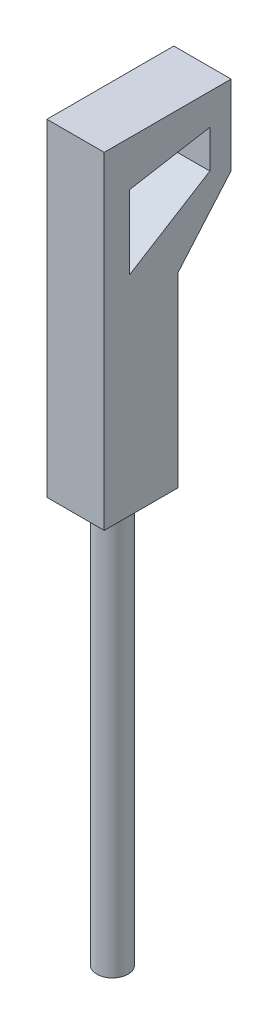
ISO-10303-21;
HEADER;
FILE_DESCRIPTION(('STEP AP214'),'2;1');
FILE_NAME('part.step','',(''),(''),'','','');
FILE_SCHEMA(('AUTOMOTIVE_DESIGN { 1 0 10303 214 1 1 1 1 }'));
ENDSEC;
DATA;
#1=APPLICATION_CONTEXT('core data for automotive mechanical design processes');
#2=APPLICATION_PROTOCOL_DEFINITION('international standard','automotive_design',2000,#1);
#3=PRODUCT_CONTEXT('',#1,'mechanical');
#4=PRODUCT('Part','Part','',(#3));
#5=PRODUCT_RELATED_PRODUCT_CATEGORY('part','',(#4));
#6=PRODUCT_DEFINITION_FORMATION('','',#4);
#7=PRODUCT_DEFINITION_CONTEXT('part definition',#1,'design');
#8=PRODUCT_DEFINITION('design','',#6,#7);
#9=PRODUCT_DEFINITION_SHAPE('','',#8);
#10=(LENGTH_UNIT() NAMED_UNIT(*) SI_UNIT(.MILLI.,.METRE.));
#11=(NAMED_UNIT(*) PLANE_ANGLE_UNIT() SI_UNIT($,.RADIAN.));
#12=(NAMED_UNIT(*) SI_UNIT($,.STERADIAN.) SOLID_ANGLE_UNIT());
#13=UNCERTAINTY_MEASURE_WITH_UNIT(LENGTH_MEASURE(1.E-05),#10,'distance_accuracy_value','');
#14=(GEOMETRIC_REPRESENTATION_CONTEXT(3) GLOBAL_UNCERTAINTY_ASSIGNED_CONTEXT((#13)) GLOBAL_UNIT_ASSIGNED_CONTEXT((#10,
#11,#12)) REPRESENTATION_CONTEXT('',''));
#15=CARTESIAN_POINT('',(0.,0.,0.));
#16=DIRECTION('',(0.,0.,1.));
#17=DIRECTION('',(1.,0.,0.));
#18=AXIS2_PLACEMENT_3D('',#15,#16,#17);
#19=CARTESIAN_POINT('',(70.,-400.,-90.));
#20=DIRECTION('',(0.,-1.,0.));
#21=DIRECTION('',(0.,0.,-1.));
#22=AXIS2_PLACEMENT_3D('',#19,#20,#21);
#23=PLANE('',#22);
#24=CARTESIAN_POINT('',(35.,-400.,-45.));
#25=DIRECTION('',(0.,-1.,0.));
#26=DIRECTION('',(0.,0.,-1.));
#27=AXIS2_PLACEMENT_3D('',#24,#25,#26);
#28=CIRCLE('',#27,19.05);
#29=CARTESIAN_POINT('',(35.,-400.,-64.05));
#30=VERTEX_POINT('',#29);
#31=EDGE_CURVE('E11',#30,#30,#28,.T.);
#32=ORIENTED_EDGE('',*,*,#31,.F.);
#33=EDGE_LOOP('',(#32));
#34=FACE_BOUND('',#33,.T.);
#35=DIRECTION('',(0.,0.,1.));
#36=VECTOR('',#35,1.);
#37=CARTESIAN_POINT('',(0.,-400.,-90.));
#38=LINE('',#37,#36);
#39=CARTESIAN_POINT('',(0.,-400.,-90.));
#40=VERTEX_POINT('',#39);
#41=CARTESIAN_POINT('',(0.,-400.,0.));
#42=VERTEX_POINT('',#41);
#43=EDGE_CURVE('E151',#40,#42,#38,.T.);
#44=ORIENTED_EDGE('',*,*,#43,.F.);
#45=DIRECTION('',(-1.,0.,0.));
#46=VECTOR('',#45,1.);
#47=CARTESIAN_POINT('',(70.,-400.,-90.));
#48=LINE('',#47,#46);
#49=CARTESIAN_POINT('',(70.,-400.,-90.));
#50=VERTEX_POINT('',#49);
#51=EDGE_CURVE('E40',#50,#40,#48,.T.);
#52=ORIENTED_EDGE('',*,*,#51,.F.);
#53=DIRECTION('',(0.,0.,1.));
#54=VECTOR('',#53,1.);
#55=CARTESIAN_POINT('',(70.,-400.,-90.));
#56=LINE('',#55,#54);
#57=CARTESIAN_POINT('',(70.,-400.,0.));
#58=VERTEX_POINT('',#57);
#59=EDGE_CURVE('E152',#50,#58,#56,.T.);
#60=ORIENTED_EDGE('',*,*,#59,.T.);
#61=DIRECTION('',(-1.,0.,0.));
#62=VECTOR('',#61,1.);
#63=CARTESIAN_POINT('',(70.,-400.,0.));
#64=LINE('',#63,#62);
#65=EDGE_CURVE('E35',#58,#42,#64,.T.);
#66=ORIENTED_EDGE('',*,*,#65,.T.);
#67=EDGE_LOOP('',(#44,#52,#60,#66));
#68=FACE_BOUND('',#67,.T.);
#69=ADVANCED_FACE('F32',(#34,#68),#23,.T.);
#70=CARTESIAN_POINT('',(70.,-172.424894861001,-90.));
#71=DIRECTION('',(0.,0.,-1.));
#72=DIRECTION('',(0.,1.,0.));
#73=AXIS2_PLACEMENT_3D('',#70,#71,#72);
#74=PLANE('',#73);
#75=DIRECTION('',(0.,-1.,0.));
#76=VECTOR('',#75,1.);
#77=CARTESIAN_POINT('',(0.,-172.424894861001,-90.));
#78=LINE('',#77,#76);
#79=CARTESIAN_POINT('',(0.,-172.424894861001,-90.));
#80=VERTEX_POINT('',#79);
#81=EDGE_CURVE('E156',#80,#40,#78,.T.);
#82=ORIENTED_EDGE('',*,*,#81,.F.);
#83=DIRECTION('',(-1.,0.,0.));
#84=VECTOR('',#83,1.);
#85=CARTESIAN_POINT('',(70.,-172.424894861001,-90.));
#86=LINE('',#85,#84);
#87=CARTESIAN_POINT('',(70.,-172.424894861001,-90.));
#88=VERTEX_POINT('',#87);
#89=EDGE_CURVE('E188',#88,#80,#86,.T.);
#90=ORIENTED_EDGE('',*,*,#89,.F.);
#91=DIRECTION('',(0.,-1.,0.));
#92=VECTOR('',#91,1.);
#93=CARTESIAN_POINT('',(70.,-172.424894861001,-90.));
#94=LINE('',#93,#92);
#95=EDGE_CURVE('E168',#88,#50,#94,.T.);
#96=ORIENTED_EDGE('',*,*,#95,.T.);
#97=ORIENTED_EDGE('',*,*,#51,.T.);
#98=EDGE_LOOP('',(#82,#90,#96,#97));
#99=FACE_BOUND('',#98,.T.);
#100=ADVANCED_FACE('F205',(#99),#74,.T.);
#101=CARTESIAN_POINT('',(70.,-97.0479044622167,-155.));
#102=DIRECTION('',(0.,-0.65305394163609,-0.757311395209108));
#103=DIRECTION('',(0.,0.757311395209108,-0.65305394163609));
#104=AXIS2_PLACEMENT_3D('',#101,#102,#103);
#105=PLANE('',#104);
#106=DIRECTION('',(0.,-0.757311395209108,0.65305394163609));
#107=VECTOR('',#106,1.);
#108=CARTESIAN_POINT('',(0.,-97.0479044622167,-155.));
#109=LINE('',#108,#107);
#110=CARTESIAN_POINT('',(0.,-97.0479044622167,-155.));
#111=VERTEX_POINT('',#110);
#112=EDGE_CURVE('E182',#111,#80,#109,.T.);
#113=ORIENTED_EDGE('',*,*,#112,.F.);
#114=DIRECTION('',(-1.,0.,0.));
#115=VECTOR('',#114,1.);
#116=CARTESIAN_POINT('',(70.,-97.0479044622167,-155.));
#117=LINE('',#116,#115);
#118=CARTESIAN_POINT('',(70.,-97.0479044622167,-155.));
#119=VERTEX_POINT('',#118);
#120=EDGE_CURVE('E190',#119,#111,#117,.T.);
#121=ORIENTED_EDGE('',*,*,#120,.F.);
#122=DIRECTION('',(0.,-0.757311395209108,0.65305394163609));
#123=VECTOR('',#122,1.);
#124=CARTESIAN_POINT('',(70.,-97.0479044622167,-155.));
#125=LINE('',#124,#123);
#126=EDGE_CURVE('E165',#119,#88,#125,.T.);
#127=ORIENTED_EDGE('',*,*,#126,.T.);
#128=ORIENTED_EDGE('',*,*,#89,.T.);
#129=EDGE_LOOP('',(#113,#121,#127,#128));
#130=FACE_BOUND('',#129,.T.);
#131=ADVANCED_FACE('F218',(#130),#105,.T.);
#132=CARTESIAN_POINT('',(70.,0.,-155.));
#133=DIRECTION('',(0.,0.,-1.));
#134=DIRECTION('',(-1.,0.,0.));
#135=AXIS2_PLACEMENT_3D('',#132,#133,#134);
#136=PLANE('',#135);
#137=DIRECTION('',(0.,-1.,0.));
#138=VECTOR('',#137,1.);
#139=CARTESIAN_POINT('',(0.,0.,-155.));
#140=LINE('',#139,#138);
#141=CARTESIAN_POINT('',(0.,0.,-155.));
#142=VERTEX_POINT('',#141);
#143=EDGE_CURVE('E179',#142,#111,#140,.T.);
#144=ORIENTED_EDGE('',*,*,#143,.F.);
#145=DIRECTION('',(-1.,0.,0.));
#146=VECTOR('',#145,1.);
#147=CARTESIAN_POINT('',(70.,0.,-155.));
#148=LINE('',#147,#146);
#149=CARTESIAN_POINT('',(70.,0.,-155.));
#150=VERTEX_POINT('',#149);
#151=EDGE_CURVE('E192',#150,#142,#148,.T.);
#152=ORIENTED_EDGE('',*,*,#151,.F.);
#153=DIRECTION('',(0.,-1.,0.));
#154=VECTOR('',#153,1.);
#155=CARTESIAN_POINT('',(70.,0.,-155.));
#156=LINE('',#155,#154);
#157=EDGE_CURVE('E162',#150,#119,#156,.T.);
#158=ORIENTED_EDGE('',*,*,#157,.T.);
#159=ORIENTED_EDGE('',*,*,#120,.T.);
#160=EDGE_LOOP('',(#144,#152,#158,#159));
#161=FACE_BOUND('',#160,.T.);
#162=ADVANCED_FACE('F216',(#161),#136,.T.);
#163=CARTESIAN_POINT('',(70.,0.,0.));
#164=DIRECTION('',(0.,1.,0.));
#165=DIRECTION('',(0.,0.,1.));
#166=AXIS2_PLACEMENT_3D('',#163,#164,#165);
#167=PLANE('',#166);
#168=DIRECTION('',(0.,0.,-1.));
#169=VECTOR('',#168,1.);
#170=CARTESIAN_POINT('',(0.,0.,0.));
#171=LINE('',#170,#169);
#172=CARTESIAN_POINT('',(0.,0.,0.));
#173=VERTEX_POINT('',#172);
#174=EDGE_CURVE('E176',#173,#142,#171,.T.);
#175=ORIENTED_EDGE('',*,*,#174,.F.);
#176=DIRECTION('',(-1.,0.,0.));
#177=VECTOR('',#176,1.);
#178=CARTESIAN_POINT('',(70.,0.,0.));
#179=LINE('',#178,#177);
#180=CARTESIAN_POINT('',(70.,0.,0.));
#181=VERTEX_POINT('',#180);
#182=EDGE_CURVE('E193',#181,#173,#179,.T.);
#183=ORIENTED_EDGE('',*,*,#182,.F.);
#184=DIRECTION('',(0.,0.,-1.));
#185=VECTOR('',#184,1.);
#186=CARTESIAN_POINT('',(70.,0.,0.));
#187=LINE('',#186,#185);
#188=EDGE_CURVE('E159',#181,#150,#187,.T.);
#189=ORIENTED_EDGE('',*,*,#188,.T.);
#190=ORIENTED_EDGE('',*,*,#151,.T.);
#191=EDGE_LOOP('',(#175,#183,#189,#190));
#192=FACE_BOUND('',#191,.T.);
#193=ADVANCED_FACE('F213',(#192),#167,.T.);
#194=CARTESIAN_POINT('',(70.,-400.,0.));
#195=DIRECTION('',(0.,0.,1.));
#196=DIRECTION('',(1.,0.,0.));
#197=AXIS2_PLACEMENT_3D('',#194,#195,#196);
#198=PLANE('',#197);
#199=DIRECTION('',(0.,1.,0.));
#200=VECTOR('',#199,1.);
#201=CARTESIAN_POINT('',(0.,-400.,0.));
#202=LINE('',#201,#200);
#203=EDGE_CURVE('E173',#42,#173,#202,.T.);
#204=ORIENTED_EDGE('',*,*,#203,.F.);
#205=ORIENTED_EDGE('',*,*,#65,.F.);
#206=DIRECTION('',(0.,1.,0.));
#207=VECTOR('',#206,1.);
#208=CARTESIAN_POINT('',(70.,-400.,0.));
#209=LINE('',#208,#207);
#210=EDGE_CURVE('E155',#58,#181,#209,.T.);
#211=ORIENTED_EDGE('',*,*,#210,.T.);
#212=ORIENTED_EDGE('',*,*,#182,.T.);
#213=EDGE_LOOP('',(#204,#205,#211,#212));
#214=FACE_BOUND('',#213,.T.);
#215=ADVANCED_FACE('F201',(#214),#198,.T.);
#216=CARTESIAN_POINT('',(70.,0.,0.));
#217=DIRECTION('',(-1.,0.,0.));
#218=DIRECTION('',(0.,0.,1.));
#219=AXIS2_PLACEMENT_3D('',#216,#217,#218);
#220=PLANE('',#219);
#221=DIRECTION('',(0.,-0.526418030023786,0.850225886259573));
#222=VECTOR('',#221,1.);
#223=CARTESIAN_POINT('',(70.,-118.692989681272,-73.4888584497566));
#224=LINE('',#223,#222);
#225=CARTESIAN_POINT('',(70.,-84.3232224799834,-129.));
#226=VERTEX_POINT('',#225);
#227=CARTESIAN_POINT('',(70.,-145.,-31.));
#228=VERTEX_POINT('',#227);
#229=EDGE_CURVE('E138',#226,#228,#224,.T.);
#230=ORIENTED_EDGE('',*,*,#229,.T.);
#231=DIRECTION('',(0.,1.,0.));
#232=VECTOR('',#231,1.);
#233=CARTESIAN_POINT('',(70.,0.,-31.));
#234=LINE('',#233,#232);
#235=CARTESIAN_POINT('',(70.,-55.,-31.));
#236=VERTEX_POINT('',#235);
#237=EDGE_CURVE('E116',#228,#236,#234,.T.);
#238=ORIENTED_EDGE('',*,*,#237,.T.);
#239=DIRECTION('',(0.,0.170916864433151,-0.985285453791103));
#240=VECTOR('',#239,1.);
#241=CARTESIAN_POINT('',(70.,-58.6137673102193,-10.1676943293238));
#242=LINE('',#241,#240);
#243=CARTESIAN_POINT('',(70.,-38.,-129.));
#244=VERTEX_POINT('',#243);
#245=EDGE_CURVE('E147',#236,#244,#242,.T.);
#246=ORIENTED_EDGE('',*,*,#245,.T.);
#247=DIRECTION('',(0.,-1.,0.));
#248=VECTOR('',#247,1.);
#249=CARTESIAN_POINT('',(70.,0.,-129.));
#250=LINE('',#249,#248);
#251=EDGE_CURVE('E144',#244,#226,#250,.T.);
#252=ORIENTED_EDGE('',*,*,#251,.T.);
#253=EDGE_LOOP('',(#230,#238,#246,#252));
#254=FACE_BOUND('',#253,.T.);
#255=ORIENTED_EDGE('',*,*,#59,.F.);
#256=ORIENTED_EDGE('',*,*,#95,.F.);
#257=ORIENTED_EDGE('',*,*,#126,.F.);
#258=ORIENTED_EDGE('',*,*,#157,.F.);
#259=ORIENTED_EDGE('',*,*,#188,.F.);
#260=ORIENTED_EDGE('',*,*,#210,.F.);
#261=EDGE_LOOP('',(#255,#256,#257,#258,#259,#260));
#262=FACE_BOUND('',#261,.T.);
#263=ADVANCED_FACE('F208',(#254,#262),#220,.F.);
#264=CARTESIAN_POINT('',(0.,0.,0.));
#265=DIRECTION('',(-1.,0.,0.));
#266=DIRECTION('',(0.,0.,1.));
#267=AXIS2_PLACEMENT_3D('',#264,#265,#266);
#268=PLANE('',#267);
#269=DIRECTION('',(0.,-1.,0.));
#270=VECTOR('',#269,1.);
#271=CARTESIAN_POINT('',(0.,-145.,-31.));
#272=LINE('',#271,#270);
#273=CARTESIAN_POINT('',(0.,-55.,-31.));
#274=VERTEX_POINT('',#273);
#275=CARTESIAN_POINT('',(0.,-145.,-31.));
#276=VERTEX_POINT('',#275);
#277=EDGE_CURVE('E113',#274,#276,#272,.T.);
#278=ORIENTED_EDGE('',*,*,#277,.T.);
#279=DIRECTION('',(0.,0.526418030023786,-0.850225886259573));
#280=VECTOR('',#279,1.);
#281=CARTESIAN_POINT('',(0.,-84.3232224799834,-129.));
#282=LINE('',#281,#280);
#283=CARTESIAN_POINT('',(0.,-84.3232224799834,-129.));
#284=VERTEX_POINT('',#283);
#285=EDGE_CURVE('E122',#276,#284,#282,.T.);
#286=ORIENTED_EDGE('',*,*,#285,.T.);
#287=DIRECTION('',(0.,1.,0.));
#288=VECTOR('',#287,1.);
#289=CARTESIAN_POINT('',(0.,-38.,-129.));
#290=LINE('',#289,#288);
#291=CARTESIAN_POINT('',(0.,-38.,-129.));
#292=VERTEX_POINT('',#291);
#293=EDGE_CURVE('E56',#284,#292,#290,.T.);
#294=ORIENTED_EDGE('',*,*,#293,.T.);
#295=DIRECTION('',(0.,-0.170916864433151,0.985285453791103));
#296=VECTOR('',#295,1.);
#297=CARTESIAN_POINT('',(0.,-55.,-31.));
#298=LINE('',#297,#296);
#299=EDGE_CURVE('E119',#292,#274,#298,.T.);
#300=ORIENTED_EDGE('',*,*,#299,.T.);
#301=EDGE_LOOP('',(#278,#286,#294,#300));
#302=FACE_BOUND('',#301,.T.);
#303=ORIENTED_EDGE('',*,*,#43,.T.);
#304=ORIENTED_EDGE('',*,*,#203,.T.);
#305=ORIENTED_EDGE('',*,*,#174,.T.);
#306=ORIENTED_EDGE('',*,*,#143,.T.);
#307=ORIENTED_EDGE('',*,*,#112,.T.);
#308=ORIENTED_EDGE('',*,*,#81,.T.);
#309=EDGE_LOOP('',(#303,#304,#305,#306,#307,#308));
#310=FACE_BOUND('',#309,.T.);
#311=ADVANCED_FACE('F126',(#302,#310),#268,.T.);
#312=CARTESIAN_POINT('',(0.,-145.,-31.));
#313=DIRECTION('',(0.,0.,1.));
#314=DIRECTION('',(1.,0.,0.));
#315=AXIS2_PLACEMENT_3D('',#312,#313,#314);
#316=PLANE('',#315);
#317=DIRECTION('',(1.,0.,0.));
#318=VECTOR('',#317,1.);
#319=CARTESIAN_POINT('',(0.,-145.,-31.));
#320=LINE('',#319,#318);
#321=EDGE_CURVE('E48',#276,#228,#320,.T.);
#322=ORIENTED_EDGE('',*,*,#321,.F.);
#323=ORIENTED_EDGE('',*,*,#277,.F.);
#324=DIRECTION('',(1.,0.,0.));
#325=VECTOR('',#324,1.);
#326=CARTESIAN_POINT('',(0.,-55.,-31.));
#327=LINE('',#326,#325);
#328=EDGE_CURVE('E136',#274,#236,#327,.T.);
#329=ORIENTED_EDGE('',*,*,#328,.T.);
#330=ORIENTED_EDGE('',*,*,#237,.F.);
#331=EDGE_LOOP('',(#322,#323,#329,#330));
#332=FACE_BOUND('',#331,.T.);
#333=ADVANCED_FACE('F110',(#332),#316,.F.);
#334=CARTESIAN_POINT('',(0.,-55.,-31.));
#335=DIRECTION('',(0.,0.985285453791103,0.170916864433151));
#336=DIRECTION('',(0.,-0.170916864433151,0.985285453791103));
#337=AXIS2_PLACEMENT_3D('',#334,#335,#336);
#338=PLANE('',#337);
#339=ORIENTED_EDGE('',*,*,#328,.F.);
#340=ORIENTED_EDGE('',*,*,#299,.F.);
#341=DIRECTION('',(1.,0.,0.));
#342=VECTOR('',#341,1.);
#343=CARTESIAN_POINT('',(0.,-38.,-129.));
#344=LINE('',#343,#342);
#345=EDGE_CURVE('E139',#292,#244,#344,.T.);
#346=ORIENTED_EDGE('',*,*,#345,.T.);
#347=ORIENTED_EDGE('',*,*,#245,.F.);
#348=EDGE_LOOP('',(#339,#340,#346,#347));
#349=FACE_BOUND('',#348,.T.);
#350=ADVANCED_FACE('F249',(#349),#338,.F.);
#351=CARTESIAN_POINT('',(0.,-38.,-129.));
#352=DIRECTION('',(0.,0.,-1.));
#353=DIRECTION('',(-1.,0.,0.));
#354=AXIS2_PLACEMENT_3D('',#351,#352,#353);
#355=PLANE('',#354);
#356=ORIENTED_EDGE('',*,*,#345,.F.);
#357=ORIENTED_EDGE('',*,*,#293,.F.);
#358=DIRECTION('',(1.,0.,0.));
#359=VECTOR('',#358,1.);
#360=CARTESIAN_POINT('',(0.,-84.3232224799834,-129.));
#361=LINE('',#360,#359);
#362=EDGE_CURVE('E118',#284,#226,#361,.T.);
#363=ORIENTED_EDGE('',*,*,#362,.T.);
#364=ORIENTED_EDGE('',*,*,#251,.F.);
#365=EDGE_LOOP('',(#356,#357,#363,#364));
#366=FACE_BOUND('',#365,.T.);
#367=ADVANCED_FACE('F245',(#366),#355,.F.);
#368=CARTESIAN_POINT('',(0.,-84.3232224799834,-129.));
#369=DIRECTION('',(0.,-0.850225886259573,-0.526418030023786));
#370=DIRECTION('',(0.,0.526418030023786,-0.850225886259573));
#371=AXIS2_PLACEMENT_3D('',#368,#369,#370);
#372=PLANE('',#371);
#373=ORIENTED_EDGE('',*,*,#362,.F.);
#374=ORIENTED_EDGE('',*,*,#285,.F.);
#375=ORIENTED_EDGE('',*,*,#321,.T.);
#376=ORIENTED_EDGE('',*,*,#229,.F.);
#377=EDGE_LOOP('',(#373,#374,#375,#376));
#378=FACE_BOUND('',#377,.T.);
#379=ADVANCED_FACE('F123',(#378),#372,.F.);
#380=CARTESIAN_POINT('',(35.,-900.,-45.));
#381=DIRECTION('',(0.,1.,0.));
#382=DIRECTION('',(0.,0.,1.));
#383=AXIS2_PLACEMENT_3D('',#380,#381,#382);
#384=CYLINDRICAL_SURFACE('',#383,19.05);
#385=CARTESIAN_POINT('',(35.,-900.,-45.));
#386=DIRECTION('',(0.,-1.,0.));
#387=DIRECTION('',(0.,0.,-1.));
#388=AXIS2_PLACEMENT_3D('',#385,#386,#387);
#389=CIRCLE('',#388,19.05);
#390=CARTESIAN_POINT('',(35.,-900.,-64.05));
#391=VERTEX_POINT('',#390);
#392=EDGE_CURVE('E129',#391,#391,#389,.T.);
#393=ORIENTED_EDGE('',*,*,#392,.F.);
#394=EDGE_LOOP('',(#393));
#395=FACE_BOUND('',#394,.T.);
#396=ORIENTED_EDGE('',*,*,#31,.T.);
#397=EDGE_LOOP('',(#396));
#398=FACE_BOUND('',#397,.T.);
#399=ADVANCED_FACE('F235',(#395,#398),#384,.T.);
#400=CARTESIAN_POINT('',(35.,-900.,-45.));
#401=DIRECTION('',(0.,-1.,0.));
#402=DIRECTION('',(0.,0.,-1.));
#403=AXIS2_PLACEMENT_3D('',#400,#401,#402);
#404=PLANE('',#403);
#405=ORIENTED_EDGE('',*,*,#392,.T.);
#406=EDGE_LOOP('',(#405));
#407=FACE_BOUND('',#406,.T.);
#408=ADVANCED_FACE('F237',(#407),#404,.T.);
#409=CLOSED_SHELL('',(#69,#100,#131,#162,#193,#215,#263,#311,#333,#350,#367,#379,#399,#408));
#410=MANIFOLD_SOLID_BREP('B2',#409);
#411=ADVANCED_BREP_SHAPE_REPRESENTATION('',(#18,#410),#14);
#412=SHAPE_DEFINITION_REPRESENTATION(#9,#411);
ENDSEC;
END-ISO-10303-21;
